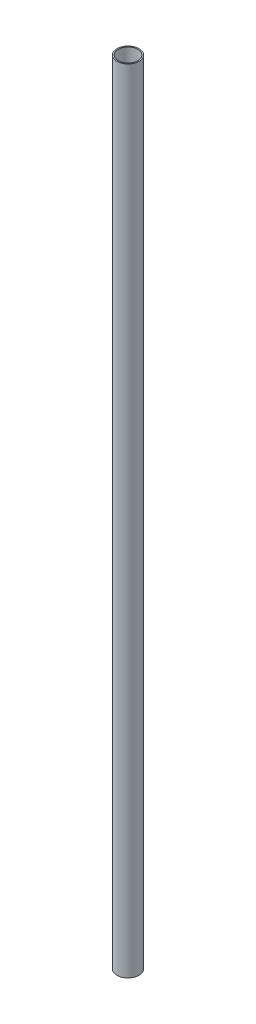
ISO-10303-21;
HEADER;
FILE_DESCRIPTION(('STEP AP214'),'2;1');
FILE_NAME('part.step','',(''),(''),'','','');
FILE_SCHEMA(('AUTOMOTIVE_DESIGN { 1 0 10303 214 1 1 1 1 }'));
ENDSEC;
DATA;
#1=APPLICATION_CONTEXT('core data for automotive mechanical design processes');
#2=APPLICATION_PROTOCOL_DEFINITION('international standard','automotive_design',2000,#1);
#3=PRODUCT_CONTEXT('',#1,'mechanical');
#4=PRODUCT('Part','Part','',(#3));
#5=PRODUCT_RELATED_PRODUCT_CATEGORY('part','',(#4));
#6=PRODUCT_DEFINITION_FORMATION('','',#4);
#7=PRODUCT_DEFINITION_CONTEXT('part definition',#1,'design');
#8=PRODUCT_DEFINITION('design','',#6,#7);
#9=PRODUCT_DEFINITION_SHAPE('','',#8);
#10=(LENGTH_UNIT() NAMED_UNIT(*) SI_UNIT(.MILLI.,.METRE.));
#11=(NAMED_UNIT(*) PLANE_ANGLE_UNIT() SI_UNIT($,.RADIAN.));
#12=(NAMED_UNIT(*) SI_UNIT($,.STERADIAN.) SOLID_ANGLE_UNIT());
#13=UNCERTAINTY_MEASURE_WITH_UNIT(LENGTH_MEASURE(1.E-05),#10,'distance_accuracy_value','');
#14=(GEOMETRIC_REPRESENTATION_CONTEXT(3) GLOBAL_UNCERTAINTY_ASSIGNED_CONTEXT((#13)) GLOBAL_UNIT_ASSIGNED_CONTEXT((#10,
#11,#12)) REPRESENTATION_CONTEXT('',''));
#15=CARTESIAN_POINT('',(0.,0.,0.));
#16=DIRECTION('',(0.,0.,1.));
#17=DIRECTION('',(1.,0.,0.));
#18=AXIS2_PLACEMENT_3D('',#15,#16,#17);
#19=CARTESIAN_POINT('',(0.,419.1,0.));
#20=DIRECTION('',(0.,1.,0.));
#21=DIRECTION('',(0.,0.,1.));
#22=AXIS2_PLACEMENT_3D('',#19,#20,#21);
#23=PLANE('',#22);
#24=CARTESIAN_POINT('',(0.,419.1,0.));
#25=DIRECTION('',(0.,1.,0.));
#26=DIRECTION('',(0.,0.,1.));
#27=AXIS2_PLACEMENT_3D('',#24,#25,#26);
#28=CIRCLE('',#27,11.665);
#29=CARTESIAN_POINT('',(0.,419.1,11.665));
#30=VERTEX_POINT('',#29);
#31=EDGE_CURVE('E10',#30,#30,#28,.T.);
#32=ORIENTED_EDGE('',*,*,#31,.T.);
#33=EDGE_LOOP('',(#32));
#34=FACE_BOUND('',#33,.T.);
#35=CARTESIAN_POINT('',(0.,419.1,0.));
#36=DIRECTION('',(0.,1.,0.));
#37=DIRECTION('',(0.,0.,1.));
#38=AXIS2_PLACEMENT_3D('',#35,#36,#37);
#39=CIRCLE('',#38,10.395);
#40=CARTESIAN_POINT('',(0.,419.1,10.395));
#41=VERTEX_POINT('',#40);
#42=EDGE_CURVE('E48',#41,#41,#39,.T.);
#43=ORIENTED_EDGE('',*,*,#42,.F.);
#44=EDGE_LOOP('',(#43));
#45=FACE_BOUND('',#44,.T.);
#46=ADVANCED_FACE('F37',(#34,#45),#23,.T.);
#47=CARTESIAN_POINT('',(0.,-419.1,0.));
#48=DIRECTION('',(0.,1.,0.));
#49=DIRECTION('',(0.,0.,1.));
#50=AXIS2_PLACEMENT_3D('',#47,#48,#49);
#51=PLANE('',#50);
#52=CARTESIAN_POINT('',(0.,-419.1,0.));
#53=DIRECTION('',(0.,1.,0.));
#54=DIRECTION('',(0.,0.,1.));
#55=AXIS2_PLACEMENT_3D('',#52,#53,#54);
#56=CIRCLE('',#55,11.665);
#57=CARTESIAN_POINT('',(0.,-419.1,11.665));
#58=VERTEX_POINT('',#57);
#59=EDGE_CURVE('E41',#58,#58,#56,.T.);
#60=ORIENTED_EDGE('',*,*,#59,.F.);
#61=EDGE_LOOP('',(#60));
#62=FACE_BOUND('',#61,.T.);
#63=CARTESIAN_POINT('',(0.,-419.1,0.));
#64=DIRECTION('',(0.,1.,0.));
#65=DIRECTION('',(0.,0.,1.));
#66=AXIS2_PLACEMENT_3D('',#63,#64,#65);
#67=CIRCLE('',#66,10.395);
#68=CARTESIAN_POINT('',(0.,-419.1,10.395));
#69=VERTEX_POINT('',#68);
#70=EDGE_CURVE('E50',#69,#69,#67,.T.);
#71=ORIENTED_EDGE('',*,*,#70,.T.);
#72=EDGE_LOOP('',(#71));
#73=FACE_BOUND('',#72,.T.);
#74=ADVANCED_FACE('F60',(#62,#73),#51,.F.);
#75=CARTESIAN_POINT('',(0.,419.1,0.));
#76=DIRECTION('',(0.,-1.,0.));
#77=DIRECTION('',(0.,0.,-1.));
#78=AXIS2_PLACEMENT_3D('',#75,#76,#77);
#79=CYLINDRICAL_SURFACE('',#78,11.665);
#80=ORIENTED_EDGE('',*,*,#31,.F.);
#81=EDGE_LOOP('',(#80));
#82=FACE_BOUND('',#81,.T.);
#83=ORIENTED_EDGE('',*,*,#59,.T.);
#84=EDGE_LOOP('',(#83));
#85=FACE_BOUND('',#84,.T.);
#86=ADVANCED_FACE('F39',(#82,#85),#79,.T.);
#87=CARTESIAN_POINT('',(0.,419.1,0.));
#88=DIRECTION('',(0.,-1.,0.));
#89=DIRECTION('',(0.,0.,-1.));
#90=AXIS2_PLACEMENT_3D('',#87,#88,#89);
#91=CYLINDRICAL_SURFACE('',#90,10.395);
#92=ORIENTED_EDGE('',*,*,#42,.T.);
#93=EDGE_LOOP('',(#92));
#94=FACE_BOUND('',#93,.T.);
#95=ORIENTED_EDGE('',*,*,#70,.F.);
#96=EDGE_LOOP('',(#95));
#97=FACE_BOUND('',#96,.T.);
#98=ADVANCED_FACE('F56',(#94,#97),#91,.F.);
#99=CLOSED_SHELL('',(#46,#74,#86,#98));
#100=MANIFOLD_SOLID_BREP('B2',#99);
#101=ADVANCED_BREP_SHAPE_REPRESENTATION('',(#18,#100),#14);
#102=SHAPE_DEFINITION_REPRESENTATION(#9,#101);
ENDSEC;
END-ISO-10303-21;
